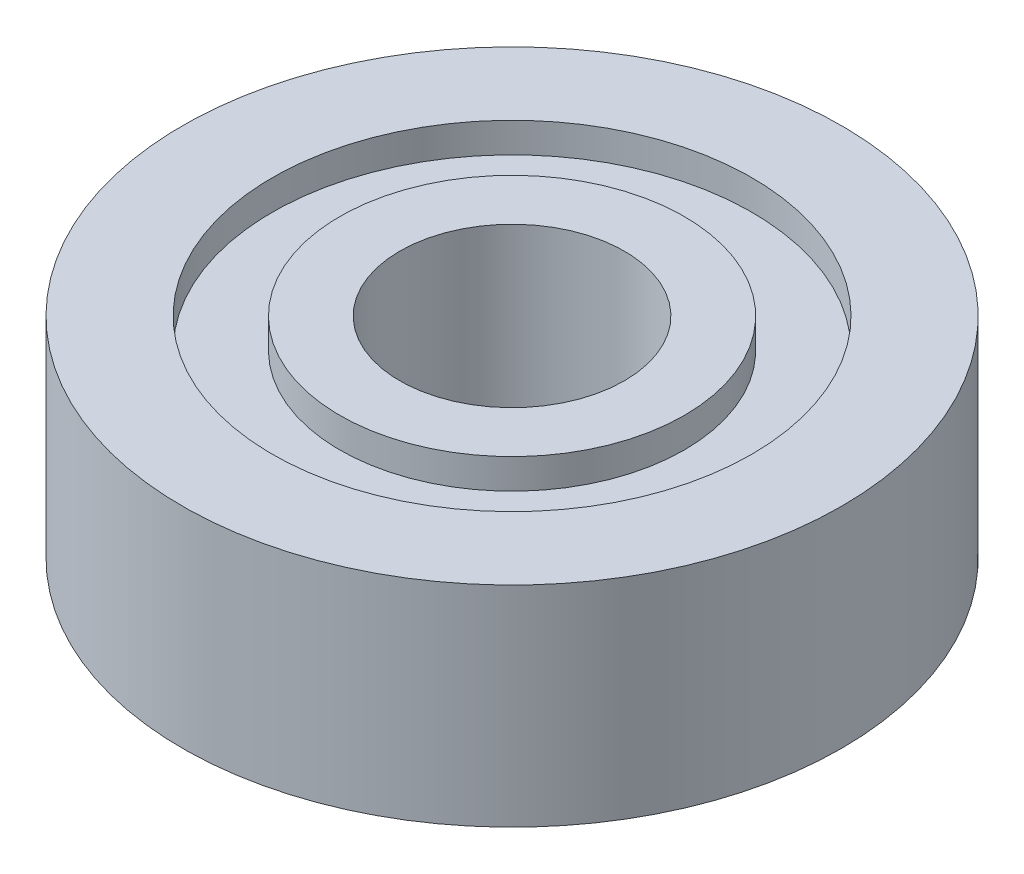
ISO-10303-21;
HEADER;
FILE_DESCRIPTION(('STEP AP214'),'2;1');
FILE_NAME('part.step','',(''),(''),'','','');
FILE_SCHEMA(('AUTOMOTIVE_DESIGN { 1 0 10303 214 1 1 1 1 }'));
ENDSEC;
DATA;
#1=APPLICATION_CONTEXT('core data for automotive mechanical design processes');
#2=APPLICATION_PROTOCOL_DEFINITION('international standard','automotive_design',2000,#1);
#3=PRODUCT_CONTEXT('',#1,'mechanical');
#4=PRODUCT('Part','Part','',(#3));
#5=PRODUCT_RELATED_PRODUCT_CATEGORY('part','',(#4));
#6=PRODUCT_DEFINITION_FORMATION('','',#4);
#7=PRODUCT_DEFINITION_CONTEXT('part definition',#1,'design');
#8=PRODUCT_DEFINITION('design','',#6,#7);
#9=PRODUCT_DEFINITION_SHAPE('','',#8);
#10=(LENGTH_UNIT() NAMED_UNIT(*) SI_UNIT(.MILLI.,.METRE.));
#11=(NAMED_UNIT(*) PLANE_ANGLE_UNIT() SI_UNIT($,.RADIAN.));
#12=(NAMED_UNIT(*) SI_UNIT($,.STERADIAN.) SOLID_ANGLE_UNIT());
#13=UNCERTAINTY_MEASURE_WITH_UNIT(LENGTH_MEASURE(1.E-05),#10,'distance_accuracy_value','');
#14=(GEOMETRIC_REPRESENTATION_CONTEXT(3) GLOBAL_UNCERTAINTY_ASSIGNED_CONTEXT((#13)) GLOBAL_UNIT_ASSIGNED_CONTEXT((#10,
#11,#12)) REPRESENTATION_CONTEXT('',''));
#15=CARTESIAN_POINT('',(0.,0.,0.));
#16=DIRECTION('',(0.,0.,1.));
#17=DIRECTION('',(1.,0.,0.));
#18=AXIS2_PLACEMENT_3D('',#15,#16,#17);
#19=CARTESIAN_POINT('',(0.,0.,0.));
#20=DIRECTION('',(0.,-1.,0.));
#21=DIRECTION('',(1.,0.,0.));
#22=AXIS2_PLACEMENT_3D('',#19,#20,#21);
#23=CYLINDRICAL_SURFACE('',#22,11.);
#24=CARTESIAN_POINT('',(0.,0.,0.));
#25=DIRECTION('',(0.,-1.,0.));
#26=DIRECTION('',(1.,0.,0.));
#27=AXIS2_PLACEMENT_3D('',#24,#25,#26);
#28=CIRCLE('',#27,11.);
#29=CARTESIAN_POINT('',(11.,0.,0.));
#30=VERTEX_POINT('',#29);
#31=EDGE_CURVE('E10',#30,#30,#28,.T.);
#32=ORIENTED_EDGE('',*,*,#31,.F.);
#33=EDGE_LOOP('',(#32));
#34=FACE_BOUND('',#33,.T.);
#35=CARTESIAN_POINT('',(0.,7.,0.));
#36=DIRECTION('',(0.,-1.,0.));
#37=DIRECTION('',(1.,0.,0.));
#38=AXIS2_PLACEMENT_3D('',#35,#36,#37);
#39=CIRCLE('',#38,11.);
#40=CARTESIAN_POINT('',(11.,7.,0.));
#41=VERTEX_POINT('',#40);
#42=EDGE_CURVE('E69',#41,#41,#39,.T.);
#43=ORIENTED_EDGE('',*,*,#42,.T.);
#44=EDGE_LOOP('',(#43));
#45=FACE_BOUND('',#44,.T.);
#46=ADVANCED_FACE('F29',(#34,#45),#23,.T.);
#47=CARTESIAN_POINT('',(-11.,0.,0.));
#48=DIRECTION('',(0.,1.,0.));
#49=DIRECTION('',(-1.,0.,0.));
#50=AXIS2_PLACEMENT_3D('',#47,#48,#49);
#51=PLANE('',#50);
#52=CARTESIAN_POINT('',(0.,0.,0.));
#53=DIRECTION('',(0.,-1.,0.));
#54=DIRECTION('',(1.,0.,0.));
#55=AXIS2_PLACEMENT_3D('',#52,#53,#54);
#56=CIRCLE('',#55,8.);
#57=CARTESIAN_POINT('',(8.,0.,0.));
#58=VERTEX_POINT('',#57);
#59=EDGE_CURVE('E35',#58,#58,#56,.T.);
#60=ORIENTED_EDGE('',*,*,#59,.F.);
#61=EDGE_LOOP('',(#60));
#62=FACE_BOUND('',#61,.T.);
#63=ORIENTED_EDGE('',*,*,#31,.T.);
#64=EDGE_LOOP('',(#63));
#65=FACE_BOUND('',#64,.T.);
#66=ADVANCED_FACE('F130',(#62,#65),#51,.F.);
#67=CARTESIAN_POINT('',(0.,0.,0.));
#68=DIRECTION('',(0.,-1.,0.));
#69=DIRECTION('',(1.,0.,0.));
#70=AXIS2_PLACEMENT_3D('',#67,#68,#69);
#71=CYLINDRICAL_SURFACE('',#70,8.);
#72=CARTESIAN_POINT('',(0.,0.999999999999999,0.));
#73=DIRECTION('',(0.,-1.,0.));
#74=DIRECTION('',(1.,0.,0.));
#75=AXIS2_PLACEMENT_3D('',#72,#73,#74);
#76=CIRCLE('',#75,8.);
#77=CARTESIAN_POINT('',(8.,0.999999999999999,0.));
#78=VERTEX_POINT('',#77);
#79=EDGE_CURVE('E39',#78,#78,#76,.T.);
#80=ORIENTED_EDGE('',*,*,#79,.F.);
#81=EDGE_LOOP('',(#80));
#82=FACE_BOUND('',#81,.T.);
#83=ORIENTED_EDGE('',*,*,#59,.T.);
#84=EDGE_LOOP('',(#83));
#85=FACE_BOUND('',#84,.T.);
#86=ADVANCED_FACE('F125',(#82,#85),#71,.F.);
#87=CARTESIAN_POINT('',(-8.,0.999999999999999,0.));
#88=DIRECTION('',(0.,1.,0.));
#89=DIRECTION('',(-1.,0.,0.));
#90=AXIS2_PLACEMENT_3D('',#87,#88,#89);
#91=PLANE('',#90);
#92=CARTESIAN_POINT('',(0.,0.999999999999999,0.));
#93=DIRECTION('',(0.,-1.,0.));
#94=DIRECTION('',(1.,0.,0.));
#95=AXIS2_PLACEMENT_3D('',#92,#93,#94);
#96=CIRCLE('',#95,5.75);
#97=CARTESIAN_POINT('',(5.75,0.999999999999999,0.));
#98=VERTEX_POINT('',#97);
#99=EDGE_CURVE('E43',#98,#98,#96,.T.);
#100=ORIENTED_EDGE('',*,*,#99,.F.);
#101=EDGE_LOOP('',(#100));
#102=FACE_BOUND('',#101,.T.);
#103=ORIENTED_EDGE('',*,*,#79,.T.);
#104=EDGE_LOOP('',(#103));
#105=FACE_BOUND('',#104,.T.);
#106=ADVANCED_FACE('F119',(#102,#105),#91,.F.);
#107=CARTESIAN_POINT('',(0.,0.,0.));
#108=DIRECTION('',(0.,-1.,0.));
#109=DIRECTION('',(1.,0.,0.));
#110=AXIS2_PLACEMENT_3D('',#107,#108,#109);
#111=CYLINDRICAL_SURFACE('',#110,5.75);
#112=CARTESIAN_POINT('',(0.,0.,0.));
#113=DIRECTION('',(0.,-1.,0.));
#114=DIRECTION('',(1.,0.,0.));
#115=AXIS2_PLACEMENT_3D('',#112,#113,#114);
#116=CIRCLE('',#115,5.75);
#117=CARTESIAN_POINT('',(5.75,0.,0.));
#118=VERTEX_POINT('',#117);
#119=EDGE_CURVE('E48',#118,#118,#116,.T.);
#120=ORIENTED_EDGE('',*,*,#119,.F.);
#121=EDGE_LOOP('',(#120));
#122=FACE_BOUND('',#121,.T.);
#123=ORIENTED_EDGE('',*,*,#99,.T.);
#124=EDGE_LOOP('',(#123));
#125=FACE_BOUND('',#124,.T.);
#126=ADVANCED_FACE('F113',(#122,#125),#111,.T.);
#127=CARTESIAN_POINT('',(-5.75,0.,0.));
#128=DIRECTION('',(0.,1.,0.));
#129=DIRECTION('',(-1.,0.,0.));
#130=AXIS2_PLACEMENT_3D('',#127,#128,#129);
#131=PLANE('',#130);
#132=CARTESIAN_POINT('',(0.,0.,0.));
#133=DIRECTION('',(0.,-1.,0.));
#134=DIRECTION('',(1.,0.,0.));
#135=AXIS2_PLACEMENT_3D('',#132,#133,#134);
#136=CIRCLE('',#135,3.75);
#137=CARTESIAN_POINT('',(3.75,0.,0.));
#138=VERTEX_POINT('',#137);
#139=EDGE_CURVE('E51',#138,#138,#136,.T.);
#140=ORIENTED_EDGE('',*,*,#139,.F.);
#141=EDGE_LOOP('',(#140));
#142=FACE_BOUND('',#141,.T.);
#143=ORIENTED_EDGE('',*,*,#119,.T.);
#144=EDGE_LOOP('',(#143));
#145=FACE_BOUND('',#144,.T.);
#146=ADVANCED_FACE('F107',(#142,#145),#131,.F.);
#147=CARTESIAN_POINT('',(0.,0.,0.));
#148=DIRECTION('',(0.,-1.,0.));
#149=DIRECTION('',(1.,0.,0.));
#150=AXIS2_PLACEMENT_3D('',#147,#148,#149);
#151=CYLINDRICAL_SURFACE('',#150,3.75);
#152=CARTESIAN_POINT('',(0.,7.,0.));
#153=DIRECTION('',(0.,-1.,0.));
#154=DIRECTION('',(1.,0.,0.));
#155=AXIS2_PLACEMENT_3D('',#152,#153,#154);
#156=CIRCLE('',#155,3.75);
#157=CARTESIAN_POINT('',(3.75,7.,0.));
#158=VERTEX_POINT('',#157);
#159=EDGE_CURVE('E54',#158,#158,#156,.T.);
#160=ORIENTED_EDGE('',*,*,#159,.F.);
#161=EDGE_LOOP('',(#160));
#162=FACE_BOUND('',#161,.T.);
#163=ORIENTED_EDGE('',*,*,#139,.T.);
#164=EDGE_LOOP('',(#163));
#165=FACE_BOUND('',#164,.T.);
#166=ADVANCED_FACE('F101',(#162,#165),#151,.F.);
#167=CARTESIAN_POINT('',(-3.75,7.,0.));
#168=DIRECTION('',(0.,-1.,0.));
#169=DIRECTION('',(1.,0.,0.));
#170=AXIS2_PLACEMENT_3D('',#167,#168,#169);
#171=PLANE('',#170);
#172=CARTESIAN_POINT('',(0.,7.,0.));
#173=DIRECTION('',(0.,-1.,0.));
#174=DIRECTION('',(1.,0.,0.));
#175=AXIS2_PLACEMENT_3D('',#172,#173,#174);
#176=CIRCLE('',#175,5.75);
#177=CARTESIAN_POINT('',(5.75,7.,0.));
#178=VERTEX_POINT('',#177);
#179=EDGE_CURVE('E57',#178,#178,#176,.T.);
#180=ORIENTED_EDGE('',*,*,#179,.F.);
#181=EDGE_LOOP('',(#180));
#182=FACE_BOUND('',#181,.T.);
#183=ORIENTED_EDGE('',*,*,#159,.T.);
#184=EDGE_LOOP('',(#183));
#185=FACE_BOUND('',#184,.T.);
#186=ADVANCED_FACE('F95',(#182,#185),#171,.F.);
#187=CARTESIAN_POINT('',(0.,0.,0.));
#188=DIRECTION('',(0.,-1.,0.));
#189=DIRECTION('',(1.,0.,0.));
#190=AXIS2_PLACEMENT_3D('',#187,#188,#189);
#191=CYLINDRICAL_SURFACE('',#190,5.75);
#192=CARTESIAN_POINT('',(0.,6.,0.));
#193=DIRECTION('',(0.,-1.,0.));
#194=DIRECTION('',(1.,0.,0.));
#195=AXIS2_PLACEMENT_3D('',#192,#193,#194);
#196=CIRCLE('',#195,5.75);
#197=CARTESIAN_POINT('',(5.75,6.,0.));
#198=VERTEX_POINT('',#197);
#199=EDGE_CURVE('E60',#198,#198,#196,.T.);
#200=ORIENTED_EDGE('',*,*,#199,.F.);
#201=EDGE_LOOP('',(#200));
#202=FACE_BOUND('',#201,.T.);
#203=ORIENTED_EDGE('',*,*,#179,.T.);
#204=EDGE_LOOP('',(#203));
#205=FACE_BOUND('',#204,.T.);
#206=ADVANCED_FACE('F89',(#202,#205),#191,.T.);
#207=CARTESIAN_POINT('',(-5.75,6.,0.));
#208=DIRECTION('',(0.,-1.,0.));
#209=DIRECTION('',(1.,0.,0.));
#210=AXIS2_PLACEMENT_3D('',#207,#208,#209);
#211=PLANE('',#210);
#212=CARTESIAN_POINT('',(0.,6.,0.));
#213=DIRECTION('',(0.,-1.,0.));
#214=DIRECTION('',(1.,0.,0.));
#215=AXIS2_PLACEMENT_3D('',#212,#213,#214);
#216=CIRCLE('',#215,8.);
#217=CARTESIAN_POINT('',(8.,6.,0.));
#218=VERTEX_POINT('',#217);
#219=EDGE_CURVE('E63',#218,#218,#216,.T.);
#220=ORIENTED_EDGE('',*,*,#219,.F.);
#221=EDGE_LOOP('',(#220));
#222=FACE_BOUND('',#221,.T.);
#223=ORIENTED_EDGE('',*,*,#199,.T.);
#224=EDGE_LOOP('',(#223));
#225=FACE_BOUND('',#224,.T.);
#226=ADVANCED_FACE('F83',(#222,#225),#211,.F.);
#227=CARTESIAN_POINT('',(0.,0.,0.));
#228=DIRECTION('',(0.,-1.,0.));
#229=DIRECTION('',(1.,0.,0.));
#230=AXIS2_PLACEMENT_3D('',#227,#228,#229);
#231=CYLINDRICAL_SURFACE('',#230,8.);
#232=CARTESIAN_POINT('',(0.,7.,0.));
#233=DIRECTION('',(0.,-1.,0.));
#234=DIRECTION('',(1.,0.,0.));
#235=AXIS2_PLACEMENT_3D('',#232,#233,#234);
#236=CIRCLE('',#235,8.);
#237=CARTESIAN_POINT('',(8.,7.,0.));
#238=VERTEX_POINT('',#237);
#239=EDGE_CURVE('E66',#238,#238,#236,.T.);
#240=ORIENTED_EDGE('',*,*,#239,.F.);
#241=EDGE_LOOP('',(#240));
#242=FACE_BOUND('',#241,.T.);
#243=ORIENTED_EDGE('',*,*,#219,.T.);
#244=EDGE_LOOP('',(#243));
#245=FACE_BOUND('',#244,.T.);
#246=ADVANCED_FACE('F77',(#242,#245),#231,.F.);
#247=CARTESIAN_POINT('',(-8.,7.,0.));
#248=DIRECTION('',(0.,-1.,0.));
#249=DIRECTION('',(1.,0.,0.));
#250=AXIS2_PLACEMENT_3D('',#247,#248,#249);
#251=PLANE('',#250);
#252=ORIENTED_EDGE('',*,*,#42,.F.);
#253=EDGE_LOOP('',(#252));
#254=FACE_BOUND('',#253,.T.);
#255=ORIENTED_EDGE('',*,*,#239,.T.);
#256=EDGE_LOOP('',(#255));
#257=FACE_BOUND('',#256,.T.);
#258=ADVANCED_FACE('F74',(#254,#257),#251,.F.);
#259=CLOSED_SHELL('',(#46,#66,#86,#106,#126,#146,#166,#186,#206,#226,#246,#258));
#260=MANIFOLD_SOLID_BREP('B2',#259);
#261=ADVANCED_BREP_SHAPE_REPRESENTATION('',(#18,#260),#14);
#262=SHAPE_DEFINITION_REPRESENTATION(#9,#261);
ENDSEC;
END-ISO-10303-21;
